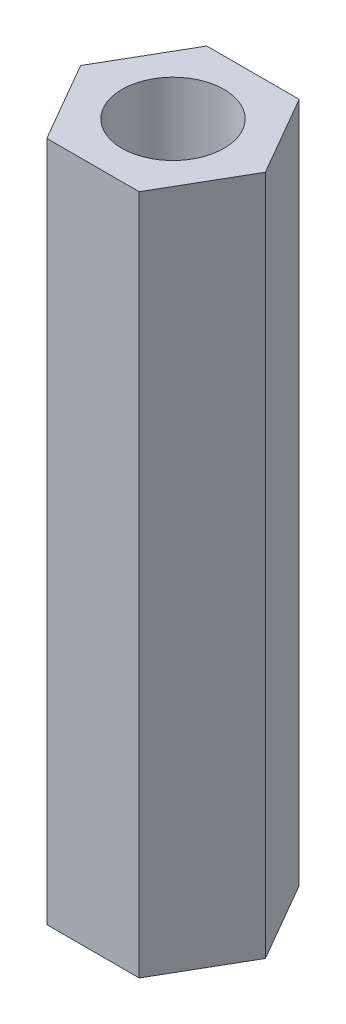
ISO-10303-21;
HEADER;
FILE_DESCRIPTION(('STEP AP214'),'2;1');
FILE_NAME('part.step','',(''),(''),'','','');
FILE_SCHEMA(('AUTOMOTIVE_DESIGN { 1 0 10303 214 1 1 1 1 }'));
ENDSEC;
DATA;
#1=APPLICATION_CONTEXT('core data for automotive mechanical design processes');
#2=APPLICATION_PROTOCOL_DEFINITION('international standard','automotive_design',2000,#1);
#3=PRODUCT_CONTEXT('',#1,'mechanical');
#4=PRODUCT('Part','Part','',(#3));
#5=PRODUCT_RELATED_PRODUCT_CATEGORY('part','',(#4));
#6=PRODUCT_DEFINITION_FORMATION('','',#4);
#7=PRODUCT_DEFINITION_CONTEXT('part definition',#1,'design');
#8=PRODUCT_DEFINITION('design','',#6,#7);
#9=PRODUCT_DEFINITION_SHAPE('','',#8);
#10=(LENGTH_UNIT() NAMED_UNIT(*) SI_UNIT(.MILLI.,.METRE.));
#11=(NAMED_UNIT(*) PLANE_ANGLE_UNIT() SI_UNIT($,.RADIAN.));
#12=(NAMED_UNIT(*) SI_UNIT($,.STERADIAN.) SOLID_ANGLE_UNIT());
#13=UNCERTAINTY_MEASURE_WITH_UNIT(LENGTH_MEASURE(1.E-05),#10,'distance_accuracy_value','');
#14=(GEOMETRIC_REPRESENTATION_CONTEXT(3) GLOBAL_UNCERTAINTY_ASSIGNED_CONTEXT((#13)) GLOBAL_UNIT_ASSIGNED_CONTEXT((#10,
#11,#12)) REPRESENTATION_CONTEXT('',''));
#15=CARTESIAN_POINT('',(0.,0.,0.));
#16=DIRECTION('',(0.,0.,1.));
#17=DIRECTION('',(1.,0.,0.));
#18=AXIS2_PLACEMENT_3D('',#15,#16,#17);
#19=CARTESIAN_POINT('',(0.,20.,0.));
#20=DIRECTION('',(0.,1.,0.));
#21=DIRECTION('',(0.,0.,1.));
#22=AXIS2_PLACEMENT_3D('',#19,#20,#21);
#23=PLANE('',#22);
#24=DIRECTION('',(1.,0.,0.));
#25=VECTOR('',#24,1.);
#26=CARTESIAN_POINT('',(-1.35677313259562,20.,2.35));
#27=LINE('',#26,#25);
#28=CARTESIAN_POINT('',(-1.35677313259562,20.,2.35));
#29=VERTEX_POINT('',#28);
#30=CARTESIAN_POINT('',(1.35677313259562,20.,2.35));
#31=VERTEX_POINT('',#30);
#32=EDGE_CURVE('E130',#29,#31,#27,.T.);
#33=ORIENTED_EDGE('',*,*,#32,.T.);
#34=DIRECTION('',(0.5,0.,-0.866025403784438));
#35=VECTOR('',#34,1.);
#36=CARTESIAN_POINT('',(1.35677313259562,20.,2.35));
#37=LINE('',#36,#35);
#38=CARTESIAN_POINT('',(2.71354626519124,20.,0.));
#39=VERTEX_POINT('',#38);
#40=EDGE_CURVE('E88',#31,#39,#37,.T.);
#41=ORIENTED_EDGE('',*,*,#40,.T.);
#42=DIRECTION('',(-0.5,0.,-0.866025403784439));
#43=VECTOR('',#42,1.);
#44=CARTESIAN_POINT('',(2.71354626519124,20.,0.));
#45=LINE('',#44,#43);
#46=CARTESIAN_POINT('',(1.35677313259562,20.,-2.35));
#47=VERTEX_POINT('',#46);
#48=EDGE_CURVE('E101',#39,#47,#45,.T.);
#49=ORIENTED_EDGE('',*,*,#48,.T.);
#50=DIRECTION('',(-1.,0.,0.));
#51=VECTOR('',#50,1.);
#52=CARTESIAN_POINT('',(1.35677313259562,20.,-2.35));
#53=LINE('',#52,#51);
#54=CARTESIAN_POINT('',(-1.35677313259562,20.,-2.35));
#55=VERTEX_POINT('',#54);
#56=EDGE_CURVE('E95',#47,#55,#53,.T.);
#57=ORIENTED_EDGE('',*,*,#56,.T.);
#58=DIRECTION('',(-0.5,0.,0.866025403784438));
#59=VECTOR('',#58,1.);
#60=CARTESIAN_POINT('',(-1.35677313259562,20.,-2.35));
#61=LINE('',#60,#59);
#62=CARTESIAN_POINT('',(-2.71354626519124,20.,0.));
#63=VERTEX_POINT('',#62);
#64=EDGE_CURVE('E99',#55,#63,#61,.T.);
#65=ORIENTED_EDGE('',*,*,#64,.T.);
#66=DIRECTION('',(0.5,0.,0.866025403784439));
#67=VECTOR('',#66,1.);
#68=CARTESIAN_POINT('',(-2.71354626519124,20.,0.));
#69=LINE('',#68,#67);
#70=EDGE_CURVE('E51',#63,#29,#69,.T.);
#71=ORIENTED_EDGE('',*,*,#70,.T.);
#72=EDGE_LOOP('',(#33,#41,#49,#57,#65,#71));
#73=FACE_BOUND('',#72,.T.);
#74=CARTESIAN_POINT('',(0.,20.,0.));
#75=DIRECTION('',(0.,1.,0.));
#76=DIRECTION('',(0.,0.,1.));
#77=AXIS2_PLACEMENT_3D('',#74,#75,#76);
#78=CIRCLE('',#77,1.5);
#79=CARTESIAN_POINT('',(0.,20.,1.5));
#80=VERTEX_POINT('',#79);
#81=EDGE_CURVE('E123',#80,#80,#78,.T.);
#82=ORIENTED_EDGE('',*,*,#81,.F.);
#83=EDGE_LOOP('',(#82));
#84=FACE_BOUND('',#83,.T.);
#85=ADVANCED_FACE('F34',(#73,#84),#23,.T.);
#86=CARTESIAN_POINT('',(0.,0.,0.));
#87=DIRECTION('',(0.,1.,0.));
#88=DIRECTION('',(0.,0.,1.));
#89=AXIS2_PLACEMENT_3D('',#86,#87,#88);
#90=PLANE('',#89);
#91=DIRECTION('',(1.,0.,0.));
#92=VECTOR('',#91,1.);
#93=CARTESIAN_POINT('',(-1.35677313259562,0.,2.35));
#94=LINE('',#93,#92);
#95=CARTESIAN_POINT('',(-1.35677313259562,0.,2.35));
#96=VERTEX_POINT('',#95);
#97=CARTESIAN_POINT('',(1.35677313259562,0.,2.35));
#98=VERTEX_POINT('',#97);
#99=EDGE_CURVE('E119',#96,#98,#94,.T.);
#100=ORIENTED_EDGE('',*,*,#99,.F.);
#101=DIRECTION('',(0.5,0.,0.866025403784439));
#102=VECTOR('',#101,1.);
#103=CARTESIAN_POINT('',(-2.71354626519124,0.,0.));
#104=LINE('',#103,#102);
#105=CARTESIAN_POINT('',(-2.71354626519124,0.,0.));
#106=VERTEX_POINT('',#105);
#107=EDGE_CURVE('E80',#106,#96,#104,.T.);
#108=ORIENTED_EDGE('',*,*,#107,.F.);
#109=DIRECTION('',(-0.5,0.,0.866025403784438));
#110=VECTOR('',#109,1.);
#111=CARTESIAN_POINT('',(-1.35677313259562,0.,-2.35));
#112=LINE('',#111,#110);
#113=CARTESIAN_POINT('',(-1.35677313259562,0.,-2.35));
#114=VERTEX_POINT('',#113);
#115=EDGE_CURVE('E74',#114,#106,#112,.T.);
#116=ORIENTED_EDGE('',*,*,#115,.F.);
#117=DIRECTION('',(-1.,0.,0.));
#118=VECTOR('',#117,1.);
#119=CARTESIAN_POINT('',(1.35677313259562,0.,-2.35));
#120=LINE('',#119,#118);
#121=CARTESIAN_POINT('',(1.35677313259562,0.,-2.35));
#122=VERTEX_POINT('',#121);
#123=EDGE_CURVE('E109',#122,#114,#120,.T.);
#124=ORIENTED_EDGE('',*,*,#123,.F.);
#125=DIRECTION('',(-0.5,0.,-0.866025403784439));
#126=VECTOR('',#125,1.);
#127=CARTESIAN_POINT('',(2.71354626519124,0.,0.));
#128=LINE('',#127,#126);
#129=CARTESIAN_POINT('',(2.71354626519124,0.,0.));
#130=VERTEX_POINT('',#129);
#131=EDGE_CURVE('E125',#130,#122,#128,.T.);
#132=ORIENTED_EDGE('',*,*,#131,.F.);
#133=DIRECTION('',(0.5,0.,-0.866025403784438));
#134=VECTOR('',#133,1.);
#135=CARTESIAN_POINT('',(1.35677313259562,0.,2.35));
#136=LINE('',#135,#134);
#137=EDGE_CURVE('E122',#98,#130,#136,.T.);
#138=ORIENTED_EDGE('',*,*,#137,.F.);
#139=EDGE_LOOP('',(#100,#108,#116,#124,#132,#138));
#140=FACE_BOUND('',#139,.T.);
#141=CARTESIAN_POINT('',(0.,0.,0.));
#142=DIRECTION('',(0.,1.,0.));
#143=DIRECTION('',(0.,0.,1.));
#144=AXIS2_PLACEMENT_3D('',#141,#142,#143);
#145=CIRCLE('',#144,1.5);
#146=CARTESIAN_POINT('',(0.,0.,1.5));
#147=VERTEX_POINT('',#146);
#148=EDGE_CURVE('E223',#147,#147,#145,.T.);
#149=ORIENTED_EDGE('',*,*,#148,.T.);
#150=EDGE_LOOP('',(#149));
#151=FACE_BOUND('',#150,.T.);
#152=ADVANCED_FACE('F139',(#140,#151),#90,.F.);
#153=CARTESIAN_POINT('',(-1.35677313259562,20.,2.35));
#154=DIRECTION('',(0.,0.,-1.));
#155=DIRECTION('',(-1.,0.,0.));
#156=AXIS2_PLACEMENT_3D('',#153,#154,#155);
#157=PLANE('',#156);
#158=ORIENTED_EDGE('',*,*,#99,.T.);
#159=DIRECTION('',(0.,-1.,0.));
#160=VECTOR('',#159,1.);
#161=CARTESIAN_POINT('',(1.35677313259562,20.,2.35));
#162=LINE('',#161,#160);
#163=EDGE_CURVE('E11',#31,#98,#162,.T.);
#164=ORIENTED_EDGE('',*,*,#163,.F.);
#165=ORIENTED_EDGE('',*,*,#32,.F.);
#166=DIRECTION('',(0.,-1.,0.));
#167=VECTOR('',#166,1.);
#168=CARTESIAN_POINT('',(-1.35677313259562,20.,2.35));
#169=LINE('',#168,#167);
#170=EDGE_CURVE('E115',#29,#96,#169,.T.);
#171=ORIENTED_EDGE('',*,*,#170,.T.);
#172=EDGE_LOOP('',(#158,#164,#165,#171));
#173=FACE_BOUND('',#172,.T.);
#174=ADVANCED_FACE('F36',(#173),#157,.F.);
#175=CARTESIAN_POINT('',(1.35677313259562,20.,2.35));
#176=DIRECTION('',(-0.866025403784439,0.,-0.5));
#177=DIRECTION('',(-0.5,0.,0.866025403784439));
#178=AXIS2_PLACEMENT_3D('',#175,#176,#177);
#179=PLANE('',#178);
#180=ORIENTED_EDGE('',*,*,#137,.T.);
#181=DIRECTION('',(0.,-1.,0.));
#182=VECTOR('',#181,1.);
#183=CARTESIAN_POINT('',(2.71354626519124,20.,0.));
#184=LINE('',#183,#182);
#185=EDGE_CURVE('E43',#39,#130,#184,.T.);
#186=ORIENTED_EDGE('',*,*,#185,.F.);
#187=ORIENTED_EDGE('',*,*,#40,.F.);
#188=ORIENTED_EDGE('',*,*,#163,.T.);
#189=EDGE_LOOP('',(#180,#186,#187,#188));
#190=FACE_BOUND('',#189,.T.);
#191=ADVANCED_FACE('F164',(#190),#179,.F.);
#192=CARTESIAN_POINT('',(2.71354626519124,20.,0.));
#193=DIRECTION('',(-0.866025403784439,0.,0.5));
#194=DIRECTION('',(0.5,0.,0.866025403784439));
#195=AXIS2_PLACEMENT_3D('',#192,#193,#194);
#196=PLANE('',#195);
#197=ORIENTED_EDGE('',*,*,#131,.T.);
#198=DIRECTION('',(0.,-1.,0.));
#199=VECTOR('',#198,1.);
#200=CARTESIAN_POINT('',(1.35677313259562,20.,-2.35));
#201=LINE('',#200,#199);
#202=EDGE_CURVE('E110',#47,#122,#201,.T.);
#203=ORIENTED_EDGE('',*,*,#202,.F.);
#204=ORIENTED_EDGE('',*,*,#48,.F.);
#205=ORIENTED_EDGE('',*,*,#185,.T.);
#206=EDGE_LOOP('',(#197,#203,#204,#205));
#207=FACE_BOUND('',#206,.T.);
#208=ADVANCED_FACE('F136',(#207),#196,.F.);
#209=CARTESIAN_POINT('',(1.35677313259562,20.,-2.35));
#210=DIRECTION('',(0.,0.,1.));
#211=DIRECTION('',(1.,0.,0.));
#212=AXIS2_PLACEMENT_3D('',#209,#210,#211);
#213=PLANE('',#212);
#214=ORIENTED_EDGE('',*,*,#123,.T.);
#215=DIRECTION('',(0.,-1.,0.));
#216=VECTOR('',#215,1.);
#217=CARTESIAN_POINT('',(-1.35677313259562,20.,-2.35));
#218=LINE('',#217,#216);
#219=EDGE_CURVE('E106',#55,#114,#218,.T.);
#220=ORIENTED_EDGE('',*,*,#219,.F.);
#221=ORIENTED_EDGE('',*,*,#56,.F.);
#222=ORIENTED_EDGE('',*,*,#202,.T.);
#223=EDGE_LOOP('',(#214,#220,#221,#222));
#224=FACE_BOUND('',#223,.T.);
#225=ADVANCED_FACE('F107',(#224),#213,.F.);
#226=CARTESIAN_POINT('',(-1.35677313259562,20.,-2.35));
#227=DIRECTION('',(0.866025403784439,0.,0.5));
#228=DIRECTION('',(0.5,0.,-0.866025403784439));
#229=AXIS2_PLACEMENT_3D('',#226,#227,#228);
#230=PLANE('',#229);
#231=ORIENTED_EDGE('',*,*,#115,.T.);
#232=DIRECTION('',(0.,-1.,0.));
#233=VECTOR('',#232,1.);
#234=CARTESIAN_POINT('',(-2.71354626519124,20.,0.));
#235=LINE('',#234,#233);
#236=EDGE_CURVE('E111',#63,#106,#235,.T.);
#237=ORIENTED_EDGE('',*,*,#236,.F.);
#238=ORIENTED_EDGE('',*,*,#64,.F.);
#239=ORIENTED_EDGE('',*,*,#219,.T.);
#240=EDGE_LOOP('',(#231,#237,#238,#239));
#241=FACE_BOUND('',#240,.T.);
#242=ADVANCED_FACE('F113',(#241),#230,.F.);
#243=CARTESIAN_POINT('',(-2.71354626519124,20.,0.));
#244=DIRECTION('',(0.866025403784439,0.,-0.5));
#245=DIRECTION('',(-0.5,0.,-0.866025403784439));
#246=AXIS2_PLACEMENT_3D('',#243,#244,#245);
#247=PLANE('',#246);
#248=ORIENTED_EDGE('',*,*,#107,.T.);
#249=ORIENTED_EDGE('',*,*,#170,.F.);
#250=ORIENTED_EDGE('',*,*,#70,.F.);
#251=ORIENTED_EDGE('',*,*,#236,.T.);
#252=EDGE_LOOP('',(#248,#249,#250,#251));
#253=FACE_BOUND('',#252,.T.);
#254=ADVANCED_FACE('F144',(#253),#247,.F.);
#255=CARTESIAN_POINT('',(0.,20.,0.));
#256=DIRECTION('',(0.,-1.,0.));
#257=DIRECTION('',(0.,0.,-1.));
#258=AXIS2_PLACEMENT_3D('',#255,#256,#257);
#259=CYLINDRICAL_SURFACE('',#258,1.5);
#260=ORIENTED_EDGE('',*,*,#81,.T.);
#261=EDGE_LOOP('',(#260));
#262=FACE_BOUND('',#261,.T.);
#263=ORIENTED_EDGE('',*,*,#148,.F.);
#264=EDGE_LOOP('',(#263));
#265=FACE_BOUND('',#264,.T.);
#266=ADVANCED_FACE('F146',(#262,#265),#259,.F.);
#267=CLOSED_SHELL('',(#85,#152,#174,#191,#208,#225,#242,#254,#266));
#268=MANIFOLD_SOLID_BREP('B2',#267);
#269=ADVANCED_BREP_SHAPE_REPRESENTATION('',(#18,#268),#14);
#270=SHAPE_DEFINITION_REPRESENTATION(#9,#269);
ENDSEC;
END-ISO-10303-21;
